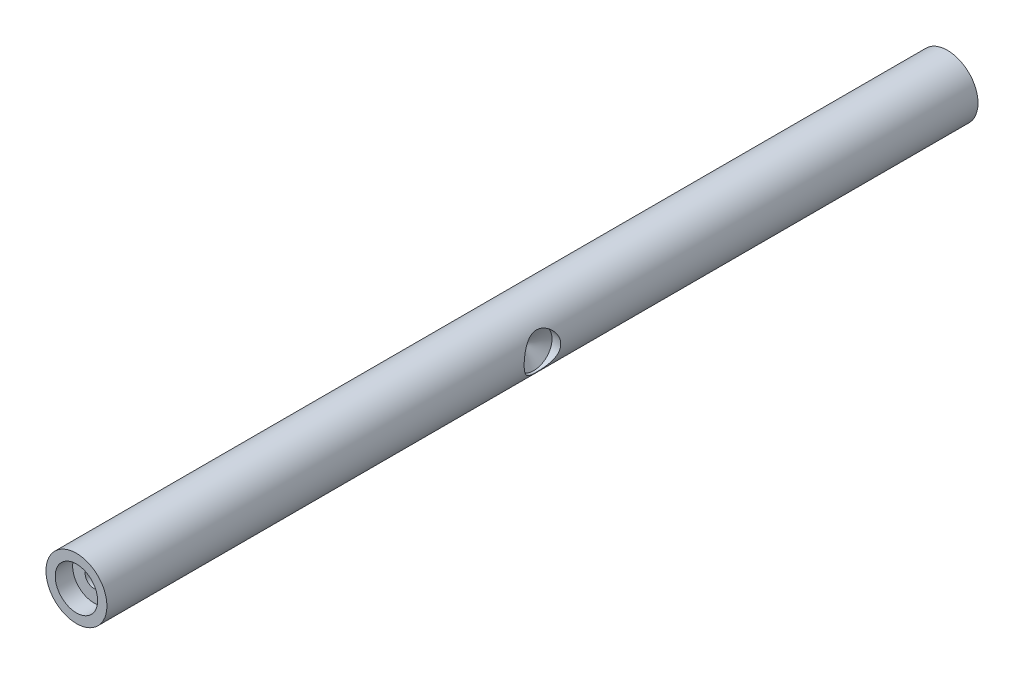
ISO-10303-21;
HEADER;
FILE_DESCRIPTION(('STEP AP214'),'2;1');
FILE_NAME('part.step','',(''),(''),'','','');
FILE_SCHEMA(('AUTOMOTIVE_DESIGN { 1 0 10303 214 1 1 1 1 }'));
ENDSEC;
DATA;
#1=APPLICATION_CONTEXT('core data for automotive mechanical design processes');
#2=APPLICATION_PROTOCOL_DEFINITION('international standard','automotive_design',2000,#1);
#3=PRODUCT_CONTEXT('',#1,'mechanical');
#4=PRODUCT('Part','Part','',(#3));
#5=PRODUCT_RELATED_PRODUCT_CATEGORY('part','',(#4));
#6=PRODUCT_DEFINITION_FORMATION('','',#4);
#7=PRODUCT_DEFINITION_CONTEXT('part definition',#1,'design');
#8=PRODUCT_DEFINITION('design','',#6,#7);
#9=PRODUCT_DEFINITION_SHAPE('','',#8);
#10=(LENGTH_UNIT() NAMED_UNIT(*) SI_UNIT(.MILLI.,.METRE.));
#11=(NAMED_UNIT(*) PLANE_ANGLE_UNIT() SI_UNIT($,.RADIAN.));
#12=(NAMED_UNIT(*) SI_UNIT($,.STERADIAN.) SOLID_ANGLE_UNIT());
#13=UNCERTAINTY_MEASURE_WITH_UNIT(LENGTH_MEASURE(1.E-05),#10,'distance_accuracy_value','');
#14=(GEOMETRIC_REPRESENTATION_CONTEXT(3) GLOBAL_UNCERTAINTY_ASSIGNED_CONTEXT((#13)) GLOBAL_UNIT_ASSIGNED_CONTEXT((#10,
#11,#12)) REPRESENTATION_CONTEXT('',''));
#15=CARTESIAN_POINT('',(0.,0.,0.));
#16=DIRECTION('',(0.,0.,1.));
#17=DIRECTION('',(1.,0.,0.));
#18=AXIS2_PLACEMENT_3D('',#15,#16,#17);
#19=CARTESIAN_POINT('',(0.,0.,-100.001));
#20=DIRECTION('',(0.,0.,1.));
#21=DIRECTION('',(1.,0.,0.));
#22=AXIS2_PLACEMENT_3D('',#19,#20,#21);
#23=CYLINDRICAL_SURFACE('',#22,2.);
#24=CARTESIAN_POINT('',(0.,0.,-100.));
#25=DIRECTION('',(0.,0.,1.));
#26=DIRECTION('',(1.,0.,0.));
#27=AXIS2_PLACEMENT_3D('',#24,#25,#26);
#28=CIRCLE('',#27,2.);
#29=CARTESIAN_POINT('',(2.,0.,-100.));
#30=VERTEX_POINT('',#29);
#31=EDGE_CURVE('E71',#30,#30,#28,.F.);
#32=CARTESIAN_POINT('',(0.,0.,96.));
#33=DIRECTION('',(0.,0.,1.));
#34=DIRECTION('',(1.,0.,0.));
#35=AXIS2_PLACEMENT_3D('',#32,#33,#34);
#36=CIRCLE('',#35,2.);
#37=CARTESIAN_POINT('',(2.,0.,96.));
#38=VERTEX_POINT('',#37);
#39=EDGE_CURVE('E69',#38,#38,#36,.F.);
#40=CARTESIAN_POINT('',(2.,0.,-100.));
#41=CARTESIAN_POINT('',(2.,0.,-97.9583333333334));
#42=CARTESIAN_POINT('',(2.,0.,-95.9166666666667));
#43=CARTESIAN_POINT('',(2.,0.,-91.8333333333334));
#44=CARTESIAN_POINT('',(2.,0.,-89.7916666666667));
#45=CARTESIAN_POINT('',(2.,0.,-85.7083333333333));
#46=CARTESIAN_POINT('',(2.,0.,-83.6666666666667));
#47=CARTESIAN_POINT('',(2.,0.,-79.5833333333334));
#48=CARTESIAN_POINT('',(2.,0.,-77.5416666666667));
#49=CARTESIAN_POINT('',(2.,0.,-73.4583333333333));
#50=CARTESIAN_POINT('',(2.,0.,-71.4166666666667));
#51=CARTESIAN_POINT('',(2.,0.,-67.3333333333333));
#52=CARTESIAN_POINT('',(2.,0.,-65.2916666666667));
#53=CARTESIAN_POINT('',(2.,0.,-61.2083333333333));
#54=CARTESIAN_POINT('',(2.,0.,-59.1666666666667));
#55=CARTESIAN_POINT('',(2.,0.,-55.0833333333333));
#56=CARTESIAN_POINT('',(2.,0.,-53.0416666666667));
#57=CARTESIAN_POINT('',(2.,0.,-48.9583333333333));
#58=CARTESIAN_POINT('',(2.,0.,-46.9166666666667));
#59=CARTESIAN_POINT('',(2.,0.,-42.8333333333333));
#60=CARTESIAN_POINT('',(2.,0.,-40.7916666666667));
#61=CARTESIAN_POINT('',(2.,0.,-36.7083333333333));
#62=CARTESIAN_POINT('',(2.,0.,-34.6666666666667));
#63=CARTESIAN_POINT('',(2.,0.,-30.5833333333333));
#64=CARTESIAN_POINT('',(2.,0.,-28.5416666666667));
#65=CARTESIAN_POINT('',(2.,0.,-24.4583333333333));
#66=CARTESIAN_POINT('',(2.,0.,-22.4166666666667));
#67=CARTESIAN_POINT('',(2.,0.,-18.3333333333333));
#68=CARTESIAN_POINT('',(2.,0.,-16.2916666666667));
#69=CARTESIAN_POINT('',(2.,0.,-12.2083333333333));
#70=CARTESIAN_POINT('',(2.,0.,-10.1666666666667));
#71=CARTESIAN_POINT('',(2.,0.,-6.08333333333334));
#72=CARTESIAN_POINT('',(2.,0.,-4.04166666666668));
#73=CARTESIAN_POINT('',(2.,0.,0.0416666666666573));
#74=CARTESIAN_POINT('',(2.,0.,2.08333333333333));
#75=CARTESIAN_POINT('',(2.,0.,6.16666666666667));
#76=CARTESIAN_POINT('',(2.,0.,8.20833333333333));
#77=CARTESIAN_POINT('',(2.,0.,12.2916666666667));
#78=CARTESIAN_POINT('',(2.,0.,14.3333333333333));
#79=CARTESIAN_POINT('',(2.,0.,18.4166666666667));
#80=CARTESIAN_POINT('',(2.,0.,20.4583333333333));
#81=CARTESIAN_POINT('',(2.,0.,24.5416666666667));
#82=CARTESIAN_POINT('',(2.,0.,26.5833333333333));
#83=CARTESIAN_POINT('',(2.,0.,30.6666666666667));
#84=CARTESIAN_POINT('',(2.,0.,32.7083333333333));
#85=CARTESIAN_POINT('',(2.,0.,36.7916666666667));
#86=CARTESIAN_POINT('',(2.,0.,38.8333333333333));
#87=CARTESIAN_POINT('',(2.,0.,42.9166666666667));
#88=CARTESIAN_POINT('',(2.,0.,44.9583333333333));
#89=CARTESIAN_POINT('',(2.,0.,49.0416666666667));
#90=CARTESIAN_POINT('',(2.,0.,51.0833333333333));
#91=CARTESIAN_POINT('',(2.,0.,55.1666666666667));
#92=CARTESIAN_POINT('',(2.,0.,57.2083333333333));
#93=CARTESIAN_POINT('',(2.,0.,61.2916666666667));
#94=CARTESIAN_POINT('',(2.,0.,63.3333333333333));
#95=CARTESIAN_POINT('',(2.,0.,67.4166666666667));
#96=CARTESIAN_POINT('',(2.,0.,69.4583333333333));
#97=CARTESIAN_POINT('',(2.,0.,73.5416666666667));
#98=CARTESIAN_POINT('',(2.,0.,75.5833333333333));
#99=CARTESIAN_POINT('',(2.,0.,79.6666666666667));
#100=CARTESIAN_POINT('',(2.,0.,81.7083333333333));
#101=CARTESIAN_POINT('',(2.,0.,85.7916666666667));
#102=CARTESIAN_POINT('',(2.,0.,87.8333333333333));
#103=CARTESIAN_POINT('',(2.,0.,91.9166666666667));
#104=CARTESIAN_POINT('',(2.,0.,93.9583333333333));
#105=CARTESIAN_POINT('',(2.,0.,96.));
#106=B_SPLINE_CURVE_WITH_KNOTS('',3,(#40,#41,#42,#43,#44,#45,#46,#47,#48,#49,#50,#51,#52,#53,
#54,#55,#56,#57,#58,#59,#60,#61,#62,#63,#64,#65,#66,#67,#68,#69,#70,#71,#72,#73,#74,#75,#76,#77,
#78,#79,#80,#81,#82,#83,#84,#85,#86,#87,#88,#89,#90,#91,#92,#93,#94,#95,#96,#97,#98,#99,#100,
#101,#102,#103,#104,#105),.UNSPECIFIED.,.F.,.F.,(4,2,2,2,2,2,2,2,2,2,2,2,2,2,2,2,2,2,2,2,2,2,2,
2,2,2,2,2,2,2,2,2,4),(0.,6.12500000000001,12.25,18.375,24.5,30.625,36.75,42.875,49.,55.125,
61.25,67.375,73.5,79.625,85.75,91.875,98.,104.125,110.25,116.375,122.5,128.625,134.75,140.875,
147.,153.125,159.25,165.375,171.5,177.625,183.75,189.875,196.),.UNSPECIFIED.);
#107=EDGE_CURVE('BSEAM38',#30,#38,#106,.T.);
#108=ORIENTED_EDGE('',*,*,#31,.T.);
#109=ORIENTED_EDGE('',*,*,#39,.F.);
#110=ORIENTED_EDGE('',*,*,#107,.T.);
#111=ORIENTED_EDGE('',*,*,#107,.F.);
#112=EDGE_LOOP('',(#108,#110,#109,#111));
#113=FACE_BOUND('',#112,.T.);
#114=ADVANCED_FACE('F38',(#113),#23,.F.);
#115=CARTESIAN_POINT('',(0.,0.,100.));
#116=DIRECTION('',(0.,0.,-1.));
#117=DIRECTION('',(-1.,0.,0.));
#118=AXIS2_PLACEMENT_3D('',#115,#116,#117);
#119=CYLINDRICAL_SURFACE('',#118,7.);
#120=CARTESIAN_POINT('',(7.,0.,-4.2));
#121=CARTESIAN_POINT('',(6.99999915100356,-0.107476288058756,-4.1999990791986));
#122=CARTESIAN_POINT('',(6.9975183074781,-0.214980012599618,-4.19586792521021));
#123=CARTESIAN_POINT('',(6.98765471650239,-0.429174862671007,-4.17939711588984));
#124=CARTESIAN_POINT('',(6.98026910092331,-0.535865475779368,-4.16705265771419));
#125=CARTESIAN_POINT('',(6.96075912416133,-0.747774687080449,-4.13428867710467));
#126=CARTESIAN_POINT('',(6.94862579476686,-0.85299010677586,-4.11385387151244));
#127=CARTESIAN_POINT('',(6.91992311944139,-1.06099814769411,-4.06518329551547));
#128=CARTESIAN_POINT('',(6.90335187403756,-1.16378971093632,-4.03694418462356));
#129=CARTESIAN_POINT('',(6.84773456425416,-1.46638711986908,-3.94134451044867));
#130=CARTESIAN_POINT('',(6.80265818958113,-1.66171518692351,-3.86289558668273));
#131=CARTESIAN_POINT('',(6.70026735632956,-2.03571657524969,-3.67958399941937));
#132=CARTESIAN_POINT('',(6.64295593656683,-2.21439401623359,-3.57472789350892));
#133=CARTESIAN_POINT('',(6.51575097646788,-2.56562852777661,-3.33263259399861));
#134=CARTESIAN_POINT('',(6.44523041724294,-2.73667271207645,-3.19353022059558));
#135=CARTESIAN_POINT('',(6.30085206376998,-3.05447411896947,-2.8910912609685));
#136=CARTESIAN_POINT('',(6.22699007804924,-3.20119969702197,-2.72772361539044));
#137=CARTESIAN_POINT('',(6.07350995025901,-3.48445910279253,-2.35781435077078));
#138=CARTESIAN_POINT('',(5.99429651393799,-3.61753724497672,-2.14843508985779));
#139=CARTESIAN_POINT('',(5.85027241871271,-3.84612046982094,-1.70562954678714));
#140=CARTESIAN_POINT('',(5.78543845979955,-3.94168653211938,-1.47224307692166));
#141=CARTESIAN_POINT('',(5.69392963344312,-4.07233681254742,-1.04552994848052));
#142=CARTESIAN_POINT('',(5.66182072619768,-4.11645352043877,-0.856139212450227));
#143=CARTESIAN_POINT('',(5.61652863392689,-4.17805282800258,-0.470949587126531));
#144=CARTESIAN_POINT('',(5.60332191956217,-4.1955685420999,-0.275158975598835));
#145=CARTESIAN_POINT('',(5.59778581943237,-4.20295427182969,0.117632159873139));
#146=CARTESIAN_POINT('',(5.60549739975556,-4.19277004018059,0.314634303007524));
#147=CARTESIAN_POINT('',(5.64069135705284,-4.14528958858348,0.703580658516316));
#148=CARTESIAN_POINT('',(5.66818860509976,-4.10797297549028,0.895520953809103));
#149=CARTESIAN_POINT('',(5.73868909921175,-4.00887020147411,1.26708435672693));
#150=CARTESIAN_POINT('',(5.78148742454302,-3.94740640560767,1.44683455943926));
#151=CARTESIAN_POINT('',(5.87795793973535,-3.80226028609667,1.79394716658529));
#152=CARTESIAN_POINT('',(5.93163411414722,-3.71856981733461,1.96130500094043));
#153=CARTESIAN_POINT('',(6.05514696343902,-3.51450985672907,2.30995024705992));
#154=CARTESIAN_POINT('',(6.12616833753978,-3.39028581353962,2.4885575790117));
#155=CARTESIAN_POINT('',(6.27006567663399,-3.11612504244885,2.82431525624408));
#156=CARTESIAN_POINT('',(6.34294335740858,-2.96616373259132,2.98144482771798));
#157=CARTESIAN_POINT('',(6.45393650093565,-2.71235349108158,3.20912395210468));
#158=CARTESIAN_POINT('',(6.4935339690117,-2.61637636674882,3.28786588878045));
#159=CARTESIAN_POINT('',(6.57027356751065,-2.41720413444134,3.43694394843046));
#160=CARTESIAN_POINT('',(6.60741664745324,-2.31401184994444,3.5072833306769));
#161=CARTESIAN_POINT('',(6.67824127139446,-2.10088267621127,3.63895388378803));
#162=CARTESIAN_POINT('',(6.71192237079492,-1.99094492358915,3.70028389807496));
#163=CARTESIAN_POINT('',(6.77483506654204,-1.76503348960551,3.8132123701576));
#164=CARTESIAN_POINT('',(6.80406940055139,-1.64906358146273,3.86481682023839));
#165=CARTESIAN_POINT('',(6.85555646673422,-1.41927125503252,3.9547346128857));
#166=CARTESIAN_POINT('',(6.8781313032985,-1.30576744388039,3.99367696883303));
#167=CARTESIAN_POINT('',(6.91794787813915,-1.07503057983455,4.06186775385759));
#168=CARTESIAN_POINT('',(6.9351926010545,-0.957799654677123,4.09112160874567));
#169=CARTESIAN_POINT('',(6.96382972550471,-0.720645586632748,4.13948113929545));
#170=CARTESIAN_POINT('',(6.97522641074934,-0.600724481712775,4.15859424344517));
#171=CARTESIAN_POINT('',(6.991821694862,-0.359258443961557,4.18637027319684));
#172=CARTESIAN_POINT('',(6.99702116547582,-0.237713741950338,4.19503466859306));
#173=CARTESIAN_POINT('',(7.00078237506091,-0.0108178820479095,4.20130411862244));
#174=CARTESIAN_POINT('',(7.0001512657249,0.094485601459678,4.20025396924758));
#175=CARTESIAN_POINT('',(6.99415891711555,0.304616524464838,4.19025957247031));
#176=CARTESIAN_POINT('',(6.98879621707028,0.409443806899331,4.18131288719022));
#177=CARTESIAN_POINT('',(6.97346923476151,0.617757955695857,4.15564438419801));
#178=CARTESIAN_POINT('',(6.96350688422223,0.721245366028227,4.13892583043258));
#179=CARTESIAN_POINT('',(6.93922316101306,0.926206396059974,4.09793660047655));
#180=CARTESIAN_POINT('',(6.92490010746784,1.02767922312419,4.07366301204383));
#181=CARTESIAN_POINT('',(6.87665996527536,1.32308571603328,3.99129619295555));
#182=CARTESIAN_POINT('',(6.83704927173041,1.51335473862237,3.9229718096092));
#183=CARTESIAN_POINT('',(6.74558711067427,1.87957746800595,3.76129855821764));
#184=CARTESIAN_POINT('',(6.693733229042,2.05552834232478,3.66794475435969));
#185=CARTESIAN_POINT('',(6.57567437520071,2.40800721308946,3.44804193931532));
#186=CARTESIAN_POINT('',(6.50853860607438,2.58270084261948,3.31905367724546));
#187=CARTESIAN_POINT('',(6.36927930658326,2.90927566958176,3.03690369910008));
#188=CARTESIAN_POINT('',(6.29715002775861,3.06112991482635,2.88371385352137));
#189=CARTESIAN_POINT('',(6.14447191091371,3.35809501885536,2.53425103549899));
#190=CARTESIAN_POINT('',(6.06405077998031,3.49974831301608,2.33496515443012));
#191=CARTESIAN_POINT('',(5.91405308679545,3.74766692603785,1.91179509751119));
#192=CARTESIAN_POINT('',(5.84446514101817,3.85396952679112,1.6879371697133));
#193=CARTESIAN_POINT('',(5.73957746102178,4.00799216140375,1.27051954333311));
#194=CARTESIAN_POINT('',(5.70011846255865,4.06340549461235,1.0808551253458));
#195=CARTESIAN_POINT('',(5.63946895946686,4.14718260414759,0.692910181425785));
#196=CARTESIAN_POINT('',(5.61825313087136,4.17558388266081,0.494642001858007));
#197=CARTESIAN_POINT('',(5.59721250839203,4.20375563728483,0.094144540729992));
#198=CARTESIAN_POINT('',(5.59746815169335,4.20341845228058,-0.108096797911474));
#199=CARTESIAN_POINT('',(5.6195360897866,4.17386128562416,-0.509304395705693));
#200=CARTESIAN_POINT('',(5.64136010616191,4.14462559874322,-0.708268814201233));
#201=CARTESIAN_POINT('',(5.70172922651825,4.06112472701725,-1.08776765488932));
#202=CARTESIAN_POINT('',(5.73941807542992,4.00813328817421,-1.26872817680758));
#203=CARTESIAN_POINT('',(5.82695390995598,3.87977132185628,-1.61934399966158));
#204=CARTESIAN_POINT('',(5.87680547305594,3.80439236642445,-1.78899501354059));
#205=CARTESIAN_POINT('',(5.99236435842285,3.62009653856416,-2.14009694517855));
#206=CARTESIAN_POINT('',(6.05933094275659,3.50780735279301,-2.31936046731291));
#207=CARTESIAN_POINT('',(6.19696106436031,3.25852890474428,-2.65825882236354));
#208=CARTESIAN_POINT('',(6.26762761164292,3.12151930301323,-2.81787730845691));
#209=CARTESIAN_POINT('',(6.41833020479227,2.80023296760907,-3.1398061387135));
#210=CARTESIAN_POINT('',(6.49801232781823,2.61189122245516,-3.29830132010492));
#211=CARTESIAN_POINT('',(6.60918643794984,2.30875200222591,-3.51069054629141));
#212=CARTESIAN_POINT('',(6.64487926750614,2.20417186654822,-3.57730636620889));
#213=CARTESIAN_POINT('',(6.71253011909066,1.9886332225965,-3.70145626971491));
#214=CARTESIAN_POINT('',(6.7444902462556,1.87767836267973,-3.75899547873462));
#215=CARTESIAN_POINT('',(6.80287490643187,1.65345592728647,-3.86275657934919));
#216=CARTESIAN_POINT('',(6.82943649202289,1.54035697094277,-3.9092656593158));
#217=CARTESIAN_POINT('',(6.87741124740216,1.30961233819501,-3.99248572566453));
#218=CARTESIAN_POINT('',(6.89882742079344,1.19196936112281,-4.02920242967098));
#219=CARTESIAN_POINT('',(6.93581647525923,0.953404354727849,-4.09221196292913));
#220=CARTESIAN_POINT('',(6.95140639257514,0.832493011906301,-4.11853519613001));
#221=CARTESIAN_POINT('',(6.97631668751654,0.588256733802265,-4.16044240928633));
#222=CARTESIAN_POINT('',(6.98564228664354,0.464933897043161,-4.17603533354934));
#223=CARTESIAN_POINT('',(6.99445220224222,0.284373607875804,-4.19074836055988));
#224=CARTESIAN_POINT('',(6.99653083457028,0.227578996689618,-4.19421587732919));
#225=CARTESIAN_POINT('',(6.99930498230715,0.113858826323686,-4.19884198098332));
#226=CARTESIAN_POINT('',(7.00000044973769,0.0569332626701202,-4.20000048777482));
#227=CARTESIAN_POINT('',(7.,0.,-4.2));
#228=B_SPLINE_CURVE_WITH_KNOTS('',3,(#120,#121,#122,#123,#124,#125,#126,#127,#128,#129,#130,
#131,#132,#133,#134,#135,#136,#137,#138,#139,#140,#141,#142,#143,#144,#145,#146,#147,#148,#149,
#150,#151,#152,#153,#154,#155,#156,#157,#158,#159,#160,#161,#162,#163,#164,#165,#166,#167,#168,
#169,#170,#171,#172,#173,#174,#175,#176,#177,#178,#179,#180,#181,#182,#183,#184,#185,#186,#187,
#188,#189,#190,#191,#192,#193,#194,#195,#196,#197,#198,#199,#200,#201,#202,#203,#204,#205,#206,
#207,#208,#209,#210,#211,#212,#213,#214,#215,#216,#217,#218,#219,#220,#221,#222,#223,#224,#225,
#226,#227),.UNSPECIFIED.,.T.,.F.,(4,2,2,2,2,2,2,2,2,2,2,2,2,2,2,2,2,2,2,2,2,2,2,2,2,2,2,2,2,2,2,
2,2,2,2,2,2,2,2,2,2,2,2,2,2,2,2,2,2,2,2,2,2,4),(0.,0.322368620832959,0.644925917066759,
0.968095473499773,1.29140357144066,1.93410509126466,2.57664716876299,3.26832475489385,
3.96089543655903,4.73838698370567,5.5146093537908,6.10338745036996,6.69143200007641,
7.28062899879255,7.87026930608065,8.45229170702202,9.03452768908854,9.71855608072051,
10.4032414689139,10.7937413183979,11.184089201389,11.5744871515861,11.9646437708932,
12.3304213589464,12.6959937543441,13.061297982935,13.4265508190783,13.7420880370991,
14.0577227042199,14.3732249340386,14.6888489315585,15.3040739986954,15.9194204778345,
16.5986142422959,17.2786033216732,18.047205347366,18.8149941926425,19.4169940441931,
20.0181568839147,20.6215719211499,21.2253150717421,21.7999707526537,22.3748430420267,
23.0379770808458,23.7016592417476,24.4736967290963,24.8603617241967,25.2468075874529,
25.6216868822358,25.9963468089117,26.369902478157,26.7431463896305,26.9139083418509,
27.0846762172399),.UNSPECIFIED.);
#229=CARTESIAN_POINT('',(7.,0.,-4.2));
#230=VERTEX_POINT('',#229);
#231=EDGE_CURVE('E11',#230,#230,#228,.T.);
#232=ORIENTED_EDGE('',*,*,#231,.T.);
#233=EDGE_LOOP('',(#232));
#234=FACE_BOUND('',#233,.T.);
#235=CARTESIAN_POINT('',(0.,0.,100.));
#236=DIRECTION('',(0.,0.,1.));
#237=DIRECTION('',(1.,0.,0.));
#238=AXIS2_PLACEMENT_3D('',#235,#236,#237);
#239=CIRCLE('',#238,7.);
#240=CARTESIAN_POINT('',(7.,0.,100.));
#241=VERTEX_POINT('',#240);
#242=EDGE_CURVE('E50',#241,#241,#239,.T.);
#243=ORIENTED_EDGE('',*,*,#242,.F.);
#244=EDGE_LOOP('',(#243));
#245=FACE_BOUND('',#244,.T.);
#246=CARTESIAN_POINT('',(0.,0.,-100.));
#247=DIRECTION('',(0.,0.,1.));
#248=DIRECTION('',(1.,0.,0.));
#249=AXIS2_PLACEMENT_3D('',#246,#247,#248);
#250=CIRCLE('',#249,7.);
#251=CARTESIAN_POINT('',(7.,0.,-100.));
#252=VERTEX_POINT('',#251);
#253=EDGE_CURVE('E74',#252,#252,#250,.T.);
#254=ORIENTED_EDGE('',*,*,#253,.T.);
#255=EDGE_LOOP('',(#254));
#256=FACE_BOUND('',#255,.T.);
#257=ADVANCED_FACE('F40',(#234,#245,#256),#119,.T.);
#258=CARTESIAN_POINT('',(0.,0.,100.));
#259=DIRECTION('',(0.,0.,1.));
#260=DIRECTION('',(1.,0.,0.));
#261=AXIS2_PLACEMENT_3D('',#258,#259,#260);
#262=PLANE('',#261);
#263=CARTESIAN_POINT('',(0.,0.,100.));
#264=DIRECTION('',(0.,0.,1.));
#265=DIRECTION('',(1.,0.,0.));
#266=AXIS2_PLACEMENT_3D('',#263,#264,#265);
#267=CIRCLE('',#266,4.87);
#268=CARTESIAN_POINT('',(4.87,0.,100.));
#269=VERTEX_POINT('',#268);
#270=EDGE_CURVE('E62',#269,#269,#267,.T.);
#271=ORIENTED_EDGE('',*,*,#270,.F.);
#272=EDGE_LOOP('',(#271));
#273=FACE_BOUND('',#272,.T.);
#274=ORIENTED_EDGE('',*,*,#242,.T.);
#275=EDGE_LOOP('',(#274));
#276=FACE_BOUND('',#275,.T.);
#277=ADVANCED_FACE('F89',(#273,#276),#262,.T.);
#278=CARTESIAN_POINT('',(0.,0.,-100.));
#279=DIRECTION('',(0.,0.,1.));
#280=DIRECTION('',(1.,0.,0.));
#281=AXIS2_PLACEMENT_3D('',#278,#279,#280);
#282=PLANE('',#281);
#283=ORIENTED_EDGE('',*,*,#31,.F.);
#284=EDGE_LOOP('',(#283));
#285=FACE_BOUND('',#284,.T.);
#286=ORIENTED_EDGE('',*,*,#253,.F.);
#287=EDGE_LOOP('',(#286));
#288=FACE_BOUND('',#287,.T.);
#289=ADVANCED_FACE('F96',(#285,#288),#282,.F.);
#290=CARTESIAN_POINT('',(0.,0.,96.));
#291=DIRECTION('',(0.,0.,1.));
#292=DIRECTION('',(1.,0.,0.));
#293=AXIS2_PLACEMENT_3D('',#290,#291,#292);
#294=PLANE('',#293);
#295=CARTESIAN_POINT('',(0.,0.,96.));
#296=DIRECTION('',(0.,0.,1.));
#297=DIRECTION('',(1.,0.,0.));
#298=AXIS2_PLACEMENT_3D('',#295,#296,#297);
#299=CIRCLE('',#298,4.87);
#300=CARTESIAN_POINT('',(4.87,0.,96.));
#301=VERTEX_POINT('',#300);
#302=EDGE_CURVE('E65',#301,#301,#299,.T.);
#303=ORIENTED_EDGE('',*,*,#302,.T.);
#304=EDGE_LOOP('',(#303));
#305=FACE_BOUND('',#304,.T.);
#306=ORIENTED_EDGE('',*,*,#39,.T.);
#307=EDGE_LOOP('',(#306));
#308=FACE_BOUND('',#307,.T.);
#309=ADVANCED_FACE('F81',(#305,#308),#294,.T.);
#310=CARTESIAN_POINT('',(0.,0.,96.));
#311=DIRECTION('',(0.,0.,1.));
#312=DIRECTION('',(1.,0.,0.));
#313=AXIS2_PLACEMENT_3D('',#310,#311,#312);
#314=CYLINDRICAL_SURFACE('',#313,4.87);
#315=ORIENTED_EDGE('',*,*,#302,.F.);
#316=EDGE_LOOP('',(#315));
#317=FACE_BOUND('',#316,.T.);
#318=ORIENTED_EDGE('',*,*,#270,.T.);
#319=EDGE_LOOP('',(#318));
#320=FACE_BOUND('',#319,.T.);
#321=ADVANCED_FACE('F93',(#317,#320),#314,.F.);
#322=CARTESIAN_POINT('',(7.,0.,0.));
#323=DIRECTION('',(1.,0.,0.));
#324=DIRECTION('',(0.,0.,-1.));
#325=AXIS2_PLACEMENT_3D('',#322,#323,#324);
#326=CYLINDRICAL_SURFACE('',#325,4.2);
#327=CARTESIAN_POINT('',(5.,0.,0.));
#328=DIRECTION('',(1.,0.,0.));
#329=DIRECTION('',(0.,0.,-1.));
#330=AXIS2_PLACEMENT_3D('',#327,#328,#329);
#331=CIRCLE('',#330,4.2);
#332=CARTESIAN_POINT('',(5.,0.,-4.2));
#333=VERTEX_POINT('',#332);
#334=EDGE_CURVE('E60',#333,#333,#331,.T.);
#335=ORIENTED_EDGE('',*,*,#334,.F.);
#336=EDGE_LOOP('',(#335));
#337=FACE_BOUND('',#336,.T.);
#338=ORIENTED_EDGE('',*,*,#231,.F.);
#339=EDGE_LOOP('',(#338));
#340=FACE_BOUND('',#339,.T.);
#341=ADVANCED_FACE('F56',(#337,#340),#326,.F.);
#342=CARTESIAN_POINT('',(5.,0.,0.));
#343=DIRECTION('',(1.,0.,0.));
#344=DIRECTION('',(0.,0.,-1.));
#345=AXIS2_PLACEMENT_3D('',#342,#343,#344);
#346=CONICAL_SURFACE('',#345,4.2,1.02974425867665);
#347=CARTESIAN_POINT('',(2.47638540008425,0.,0.));
#348=VERTEX_POINT('',#347);
#349=VERTEX_LOOP('',#348);
#350=FACE_BOUND('',#349,.T.);
#351=ORIENTED_EDGE('',*,*,#334,.T.);
#352=EDGE_LOOP('',(#351));
#353=FACE_BOUND('',#352,.T.);
#354=ADVANCED_FACE('F53',(#350,#353),#346,.F.);
#355=CLOSED_SHELL('',(#114,#257,#277,#289,#309,#321,#341,#354));
#356=MANIFOLD_SOLID_BREP('B2',#355);
#357=ADVANCED_BREP_SHAPE_REPRESENTATION('',(#18,#356),#14);
#358=SHAPE_DEFINITION_REPRESENTATION(#9,#357);
ENDSEC;
END-ISO-10303-21;
